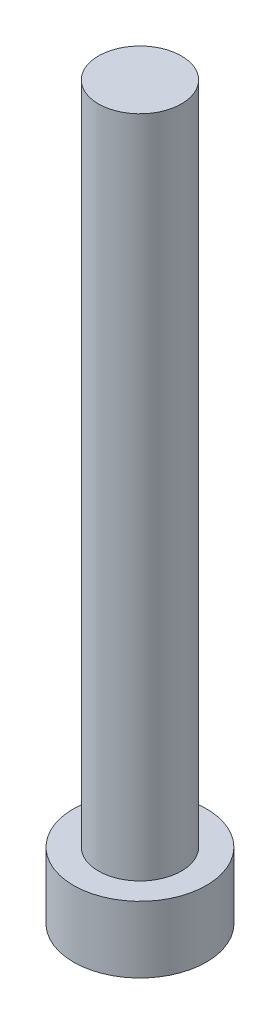
ISO-10303-21;
HEADER;
FILE_DESCRIPTION(('STEP AP214'),'2;1');
FILE_NAME('part.step','',(''),(''),'','','');
FILE_SCHEMA(('AUTOMOTIVE_DESIGN { 1 0 10303 214 1 1 1 1 }'));
ENDSEC;
DATA;
#1=APPLICATION_CONTEXT('core data for automotive mechanical design processes');
#2=APPLICATION_PROTOCOL_DEFINITION('international standard','automotive_design',2000,#1);
#3=PRODUCT_CONTEXT('',#1,'mechanical');
#4=PRODUCT('Part','Part','',(#3));
#5=PRODUCT_RELATED_PRODUCT_CATEGORY('part','',(#4));
#6=PRODUCT_DEFINITION_FORMATION('','',#4);
#7=PRODUCT_DEFINITION_CONTEXT('part definition',#1,'design');
#8=PRODUCT_DEFINITION('design','',#6,#7);
#9=PRODUCT_DEFINITION_SHAPE('','',#8);
#10=(LENGTH_UNIT() NAMED_UNIT(*) SI_UNIT(.MILLI.,.METRE.));
#11=(NAMED_UNIT(*) PLANE_ANGLE_UNIT() SI_UNIT($,.RADIAN.));
#12=(NAMED_UNIT(*) SI_UNIT($,.STERADIAN.) SOLID_ANGLE_UNIT());
#13=UNCERTAINTY_MEASURE_WITH_UNIT(LENGTH_MEASURE(1.E-05),#10,'distance_accuracy_value','');
#14=(GEOMETRIC_REPRESENTATION_CONTEXT(3) GLOBAL_UNCERTAINTY_ASSIGNED_CONTEXT((#13)) GLOBAL_UNIT_ASSIGNED_CONTEXT((#10,
#11,#12)) REPRESENTATION_CONTEXT('',''));
#15=CARTESIAN_POINT('',(0.,0.,0.));
#16=DIRECTION('',(0.,0.,1.));
#17=DIRECTION('',(1.,0.,0.));
#18=AXIS2_PLACEMENT_3D('',#15,#16,#17);
#19=CARTESIAN_POINT('',(0.,20.,0.));
#20=DIRECTION('',(0.,-1.,0.));
#21=DIRECTION('',(0.,0.,-1.));
#22=AXIS2_PLACEMENT_3D('',#19,#20,#21);
#23=CYLINDRICAL_SURFACE('',#22,1.25);
#24=CARTESIAN_POINT('',(0.,20.,0.));
#25=DIRECTION('',(0.,1.,0.));
#26=DIRECTION('',(0.,0.,1.));
#27=AXIS2_PLACEMENT_3D('',#24,#25,#26);
#28=CIRCLE('',#27,1.25);
#29=CARTESIAN_POINT('',(0.,20.,1.25));
#30=VERTEX_POINT('',#29);
#31=EDGE_CURVE('E10',#30,#30,#28,.T.);
#32=ORIENTED_EDGE('',*,*,#31,.F.);
#33=EDGE_LOOP('',(#32));
#34=FACE_BOUND('',#33,.T.);
#35=CARTESIAN_POINT('',(0.,0.,0.));
#36=DIRECTION('',(0.,1.,0.));
#37=DIRECTION('',(0.,0.,1.));
#38=AXIS2_PLACEMENT_3D('',#35,#36,#37);
#39=CIRCLE('',#38,1.25);
#40=CARTESIAN_POINT('',(0.,0.,1.25));
#41=VERTEX_POINT('',#40);
#42=EDGE_CURVE('E36',#41,#41,#39,.T.);
#43=ORIENTED_EDGE('',*,*,#42,.T.);
#44=EDGE_LOOP('',(#43));
#45=FACE_BOUND('',#44,.T.);
#46=ADVANCED_FACE('F33',(#34,#45),#23,.T.);
#47=CARTESIAN_POINT('',(0.,20.,0.));
#48=DIRECTION('',(0.,1.,0.));
#49=DIRECTION('',(0.,0.,1.));
#50=AXIS2_PLACEMENT_3D('',#47,#48,#49);
#51=PLANE('',#50);
#52=ORIENTED_EDGE('',*,*,#31,.T.);
#53=EDGE_LOOP('',(#52));
#54=FACE_BOUND('',#53,.T.);
#55=ADVANCED_FACE('F64',(#54),#51,.T.);
#56=CARTESIAN_POINT('',(0.,-2.,0.));
#57=DIRECTION('',(0.,1.,0.));
#58=DIRECTION('',(0.,0.,1.));
#59=AXIS2_PLACEMENT_3D('',#56,#57,#58);
#60=CYLINDRICAL_SURFACE('',#59,2.);
#61=CARTESIAN_POINT('',(0.,-2.,0.));
#62=DIRECTION('',(0.,1.,0.));
#63=DIRECTION('',(0.,0.,1.));
#64=AXIS2_PLACEMENT_3D('',#61,#62,#63);
#65=CIRCLE('',#64,2.);
#66=CARTESIAN_POINT('',(0.,-2.,2.));
#67=VERTEX_POINT('',#66);
#68=EDGE_CURVE('E43',#67,#67,#65,.T.);
#69=ORIENTED_EDGE('',*,*,#68,.T.);
#70=EDGE_LOOP('',(#69));
#71=FACE_BOUND('',#70,.T.);
#72=CARTESIAN_POINT('',(0.,0.,0.));
#73=DIRECTION('',(0.,1.,0.));
#74=DIRECTION('',(0.,0.,1.));
#75=AXIS2_PLACEMENT_3D('',#72,#73,#74);
#76=CIRCLE('',#75,2.);
#77=CARTESIAN_POINT('',(0.,0.,2.));
#78=VERTEX_POINT('',#77);
#79=EDGE_CURVE('E45',#78,#78,#76,.T.);
#80=ORIENTED_EDGE('',*,*,#79,.F.);
#81=EDGE_LOOP('',(#80));
#82=FACE_BOUND('',#81,.T.);
#83=ADVANCED_FACE('F51',(#71,#82),#60,.T.);
#84=CARTESIAN_POINT('',(0.,-2.,0.));
#85=DIRECTION('',(0.,1.,0.));
#86=DIRECTION('',(0.,0.,1.));
#87=AXIS2_PLACEMENT_3D('',#84,#85,#86);
#88=PLANE('',#87);
#89=ORIENTED_EDGE('',*,*,#68,.F.);
#90=EDGE_LOOP('',(#89));
#91=FACE_BOUND('',#90,.T.);
#92=ADVANCED_FACE('F54',(#91),#88,.F.);
#93=CARTESIAN_POINT('',(0.,0.,0.));
#94=DIRECTION('',(0.,1.,0.));
#95=DIRECTION('',(0.,0.,1.));
#96=AXIS2_PLACEMENT_3D('',#93,#94,#95);
#97=PLANE('',#96);
#98=ORIENTED_EDGE('',*,*,#42,.F.);
#99=EDGE_LOOP('',(#98));
#100=FACE_BOUND('',#99,.T.);
#101=ORIENTED_EDGE('',*,*,#79,.T.);
#102=EDGE_LOOP('',(#101));
#103=FACE_BOUND('',#102,.T.);
#104=ADVANCED_FACE('F56',(#100,#103),#97,.T.);
#105=CLOSED_SHELL('',(#46,#55,#83,#92,#104));
#106=MANIFOLD_SOLID_BREP('B2',#105);
#107=ADVANCED_BREP_SHAPE_REPRESENTATION('',(#18,#106),#14);
#108=SHAPE_DEFINITION_REPRESENTATION(#9,#107);
ENDSEC;
END-ISO-10303-21;
